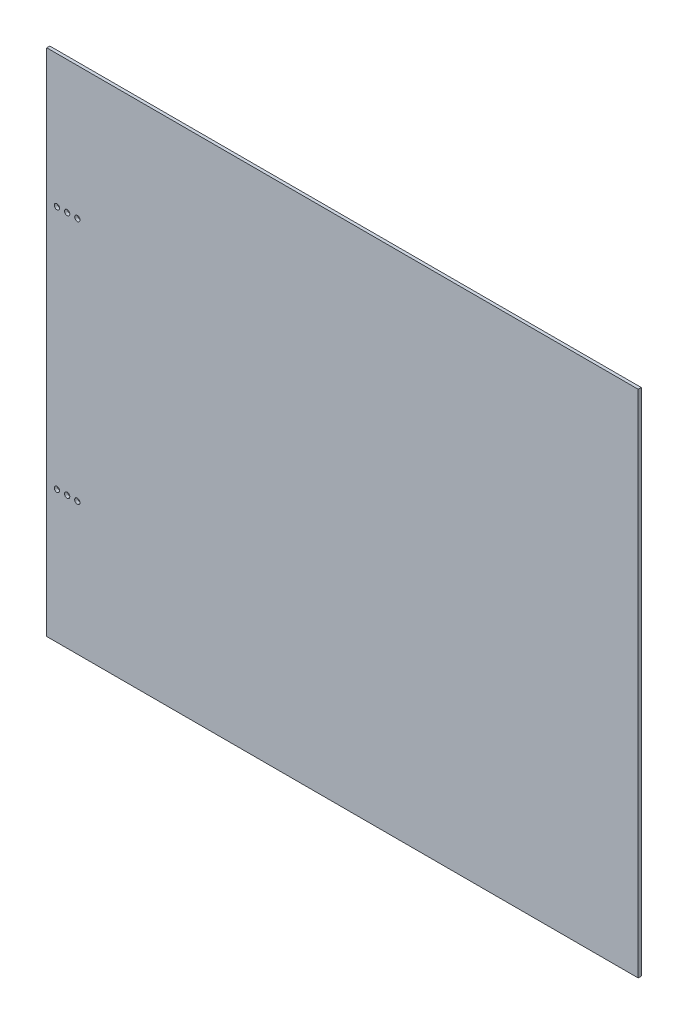
ISO-10303-21;
HEADER;
FILE_DESCRIPTION(('STEP AP214'),'2;1');
FILE_NAME('part.step','',(''),(''),'','','');
FILE_SCHEMA(('AUTOMOTIVE_DESIGN { 1 0 10303 214 1 1 1 1 }'));
ENDSEC;
DATA;
#1=APPLICATION_CONTEXT('core data for automotive mechanical design processes');
#2=APPLICATION_PROTOCOL_DEFINITION('international standard','automotive_design',2000,#1);
#3=PRODUCT_CONTEXT('',#1,'mechanical');
#4=PRODUCT('Part','Part','',(#3));
#5=PRODUCT_RELATED_PRODUCT_CATEGORY('part','',(#4));
#6=PRODUCT_DEFINITION_FORMATION('','',#4);
#7=PRODUCT_DEFINITION_CONTEXT('part definition',#1,'design');
#8=PRODUCT_DEFINITION('design','',#6,#7);
#9=PRODUCT_DEFINITION_SHAPE('','',#8);
#10=(LENGTH_UNIT() NAMED_UNIT(*) SI_UNIT(.MILLI.,.METRE.));
#11=(NAMED_UNIT(*) PLANE_ANGLE_UNIT() SI_UNIT($,.RADIAN.));
#12=(NAMED_UNIT(*) SI_UNIT($,.STERADIAN.) SOLID_ANGLE_UNIT());
#13=UNCERTAINTY_MEASURE_WITH_UNIT(LENGTH_MEASURE(1.E-05),#10,'distance_accuracy_value','');
#14=(GEOMETRIC_REPRESENTATION_CONTEXT(3) GLOBAL_UNCERTAINTY_ASSIGNED_CONTEXT((#13)) GLOBAL_UNIT_ASSIGNED_CONTEXT((#10,
#11,#12)) REPRESENTATION_CONTEXT('',''));
#15=CARTESIAN_POINT('',(0.,0.,0.));
#16=DIRECTION('',(0.,0.,1.));
#17=DIRECTION('',(1.,0.,0.));
#18=AXIS2_PLACEMENT_3D('',#15,#16,#17);
#19=CARTESIAN_POINT('',(0.,0.,3.));
#20=DIRECTION('',(0.,0.,-1.));
#21=DIRECTION('',(-1.,0.,0.));
#22=AXIS2_PLACEMENT_3D('',#19,#20,#21);
#23=PLANE('',#22);
#24=DIRECTION('',(0.,-1.,0.));
#25=VECTOR('',#24,1.);
#26=CARTESIAN_POINT('',(0.,0.,3.));
#27=LINE('',#26,#25);
#28=CARTESIAN_POINT('',(0.,500.,3.));
#29=VERTEX_POINT('',#28);
#30=CARTESIAN_POINT('',(0.,0.,3.));
#31=VERTEX_POINT('',#30);
#32=EDGE_CURVE('E86',#29,#31,#27,.T.);
#33=ORIENTED_EDGE('',*,*,#32,.T.);
#34=DIRECTION('',(1.,0.,0.));
#35=VECTOR('',#34,1.);
#36=CARTESIAN_POINT('',(0.,0.,3.));
#37=LINE('',#36,#35);
#38=CARTESIAN_POINT('',(580.,0.,3.));
#39=VERTEX_POINT('',#38);
#40=EDGE_CURVE('E81',#31,#39,#37,.T.);
#41=ORIENTED_EDGE('',*,*,#40,.T.);
#42=DIRECTION('',(0.,1.,0.));
#43=VECTOR('',#42,1.);
#44=CARTESIAN_POINT('',(580.,0.,3.));
#45=LINE('',#44,#43);
#46=CARTESIAN_POINT('',(580.,500.,3.));
#47=VERTEX_POINT('',#46);
#48=EDGE_CURVE('E84',#39,#47,#45,.T.);
#49=ORIENTED_EDGE('',*,*,#48,.T.);
#50=DIRECTION('',(-1.,0.,0.));
#51=VECTOR('',#50,1.);
#52=CARTESIAN_POINT('',(0.,500.,3.));
#53=LINE('',#52,#51);
#54=EDGE_CURVE('E51',#47,#29,#53,.T.);
#55=ORIENTED_EDGE('',*,*,#54,.T.);
#56=EDGE_LOOP('',(#33,#41,#49,#55));
#57=FACE_BOUND('',#56,.T.);
#58=CARTESIAN_POINT('',(10.,370.,3.));
#59=DIRECTION('',(0.,0.,1.));
#60=DIRECTION('',(1.,0.,0.));
#61=AXIS2_PLACEMENT_3D('',#58,#59,#60);
#62=CIRCLE('',#61,2.59999999999999);
#63=CARTESIAN_POINT('',(12.6,370.,3.));
#64=VERTEX_POINT('',#63);
#65=EDGE_CURVE('E101',#64,#64,#62,.T.);
#66=ORIENTED_EDGE('',*,*,#65,.F.);
#67=EDGE_LOOP('',(#66));
#68=FACE_BOUND('',#67,.T.);
#69=CARTESIAN_POINT('',(10.,130.,3.));
#70=DIRECTION('',(0.,0.,1.));
#71=DIRECTION('',(1.,0.,0.));
#72=AXIS2_PLACEMENT_3D('',#69,#70,#71);
#73=CIRCLE('',#72,2.59999999999999);
#74=CARTESIAN_POINT('',(12.6,130.,3.));
#75=VERTEX_POINT('',#74);
#76=EDGE_CURVE('E116',#75,#75,#73,.T.);
#77=ORIENTED_EDGE('',*,*,#76,.F.);
#78=EDGE_LOOP('',(#77));
#79=FACE_BOUND('',#78,.T.);
#80=CARTESIAN_POINT('',(20.,370.,3.));
#81=DIRECTION('',(0.,0.,1.));
#82=DIRECTION('',(1.,0.,0.));
#83=AXIS2_PLACEMENT_3D('',#80,#81,#82);
#84=CIRCLE('',#83,2.59999999999998);
#85=CARTESIAN_POINT('',(22.6,370.,3.));
#86=VERTEX_POINT('',#85);
#87=EDGE_CURVE('E122',#86,#86,#84,.T.);
#88=ORIENTED_EDGE('',*,*,#87,.F.);
#89=EDGE_LOOP('',(#88));
#90=FACE_BOUND('',#89,.T.);
#91=CARTESIAN_POINT('',(20.,130.,3.));
#92=DIRECTION('',(0.,0.,1.));
#93=DIRECTION('',(1.,0.,0.));
#94=AXIS2_PLACEMENT_3D('',#91,#92,#93);
#95=CIRCLE('',#94,2.59999999999999);
#96=CARTESIAN_POINT('',(22.6,130.,3.));
#97=VERTEX_POINT('',#96);
#98=EDGE_CURVE('E128',#97,#97,#95,.T.);
#99=ORIENTED_EDGE('',*,*,#98,.F.);
#100=EDGE_LOOP('',(#99));
#101=FACE_BOUND('',#100,.T.);
#102=CARTESIAN_POINT('',(30.,370.,3.));
#103=DIRECTION('',(0.,0.,1.));
#104=DIRECTION('',(1.,0.,0.));
#105=AXIS2_PLACEMENT_3D('',#102,#103,#104);
#106=CIRCLE('',#105,2.59999999999999);
#107=CARTESIAN_POINT('',(32.6,370.,3.));
#108=VERTEX_POINT('',#107);
#109=EDGE_CURVE('E134',#108,#108,#106,.T.);
#110=ORIENTED_EDGE('',*,*,#109,.F.);
#111=EDGE_LOOP('',(#110));
#112=FACE_BOUND('',#111,.T.);
#113=CARTESIAN_POINT('',(30.,130.,3.));
#114=DIRECTION('',(0.,0.,1.));
#115=DIRECTION('',(1.,0.,0.));
#116=AXIS2_PLACEMENT_3D('',#113,#114,#115);
#117=CIRCLE('',#116,2.59999999999999);
#118=CARTESIAN_POINT('',(32.6,130.,3.));
#119=VERTEX_POINT('',#118);
#120=EDGE_CURVE('E140',#119,#119,#117,.T.);
#121=ORIENTED_EDGE('',*,*,#120,.F.);
#122=EDGE_LOOP('',(#121));
#123=FACE_BOUND('',#122,.T.);
#124=ADVANCED_FACE('F34',(#57,#68,#79,#90,#101,#112,#123),#23,.F.);
#125=CARTESIAN_POINT('',(0.,0.,0.));
#126=DIRECTION('',(0.,0.,-1.));
#127=DIRECTION('',(-1.,0.,0.));
#128=AXIS2_PLACEMENT_3D('',#125,#126,#127);
#129=PLANE('',#128);
#130=CARTESIAN_POINT('',(30.,370.,0.));
#131=DIRECTION('',(0.,0.,1.));
#132=DIRECTION('',(1.,0.,0.));
#133=AXIS2_PLACEMENT_3D('',#130,#131,#132);
#134=CIRCLE('',#133,2.59999999999999);
#135=CARTESIAN_POINT('',(32.6,370.,0.));
#136=VERTEX_POINT('',#135);
#137=EDGE_CURVE('E137',#136,#136,#134,.T.);
#138=ORIENTED_EDGE('',*,*,#137,.T.);
#139=EDGE_LOOP('',(#138));
#140=FACE_BOUND('',#139,.T.);
#141=CARTESIAN_POINT('',(20.,370.,0.));
#142=DIRECTION('',(0.,0.,1.));
#143=DIRECTION('',(1.,0.,0.));
#144=AXIS2_PLACEMENT_3D('',#141,#142,#143);
#145=CIRCLE('',#144,2.59999999999998);
#146=CARTESIAN_POINT('',(22.6,370.,0.));
#147=VERTEX_POINT('',#146);
#148=EDGE_CURVE('E125',#147,#147,#145,.T.);
#149=ORIENTED_EDGE('',*,*,#148,.T.);
#150=EDGE_LOOP('',(#149));
#151=FACE_BOUND('',#150,.T.);
#152=CARTESIAN_POINT('',(10.,370.,0.));
#153=DIRECTION('',(0.,0.,1.));
#154=DIRECTION('',(1.,0.,0.));
#155=AXIS2_PLACEMENT_3D('',#152,#153,#154);
#156=CIRCLE('',#155,2.59999999999999);
#157=CARTESIAN_POINT('',(12.6,370.,0.));
#158=VERTEX_POINT('',#157);
#159=EDGE_CURVE('E113',#158,#158,#156,.T.);
#160=ORIENTED_EDGE('',*,*,#159,.T.);
#161=EDGE_LOOP('',(#160));
#162=FACE_BOUND('',#161,.T.);
#163=DIRECTION('',(0.,-1.,0.));
#164=VECTOR('',#163,1.);
#165=CARTESIAN_POINT('',(0.,0.,0.));
#166=LINE('',#165,#164);
#167=CARTESIAN_POINT('',(0.,500.,0.));
#168=VERTEX_POINT('',#167);
#169=CARTESIAN_POINT('',(0.,0.,0.));
#170=VERTEX_POINT('',#169);
#171=EDGE_CURVE('E98',#168,#170,#166,.T.);
#172=ORIENTED_EDGE('',*,*,#171,.F.);
#173=DIRECTION('',(-1.,0.,0.));
#174=VECTOR('',#173,1.);
#175=CARTESIAN_POINT('',(0.,500.,0.));
#176=LINE('',#175,#174);
#177=CARTESIAN_POINT('',(580.,500.,0.));
#178=VERTEX_POINT('',#177);
#179=EDGE_CURVE('E74',#178,#168,#176,.T.);
#180=ORIENTED_EDGE('',*,*,#179,.F.);
#181=DIRECTION('',(0.,1.,0.));
#182=VECTOR('',#181,1.);
#183=CARTESIAN_POINT('',(580.,0.,0.));
#184=LINE('',#183,#182);
#185=CARTESIAN_POINT('',(580.,0.,0.));
#186=VERTEX_POINT('',#185);
#187=EDGE_CURVE('E68',#186,#178,#184,.T.);
#188=ORIENTED_EDGE('',*,*,#187,.F.);
#189=DIRECTION('',(1.,0.,0.));
#190=VECTOR('',#189,1.);
#191=CARTESIAN_POINT('',(0.,0.,0.));
#192=LINE('',#191,#190);
#193=EDGE_CURVE('E90',#170,#186,#192,.T.);
#194=ORIENTED_EDGE('',*,*,#193,.F.);
#195=EDGE_LOOP('',(#172,#180,#188,#194));
#196=FACE_BOUND('',#195,.T.);
#197=CARTESIAN_POINT('',(10.,130.,0.));
#198=DIRECTION('',(0.,0.,1.));
#199=DIRECTION('',(1.,0.,0.));
#200=AXIS2_PLACEMENT_3D('',#197,#198,#199);
#201=CIRCLE('',#200,2.59999999999999);
#202=CARTESIAN_POINT('',(12.6,130.,0.));
#203=VERTEX_POINT('',#202);
#204=EDGE_CURVE('E119',#203,#203,#201,.T.);
#205=ORIENTED_EDGE('',*,*,#204,.T.);
#206=EDGE_LOOP('',(#205));
#207=FACE_BOUND('',#206,.T.);
#208=CARTESIAN_POINT('',(20.,130.,0.));
#209=DIRECTION('',(0.,0.,1.));
#210=DIRECTION('',(1.,0.,0.));
#211=AXIS2_PLACEMENT_3D('',#208,#209,#210);
#212=CIRCLE('',#211,2.59999999999999);
#213=CARTESIAN_POINT('',(22.6,130.,0.));
#214=VERTEX_POINT('',#213);
#215=EDGE_CURVE('E131',#214,#214,#212,.T.);
#216=ORIENTED_EDGE('',*,*,#215,.T.);
#217=EDGE_LOOP('',(#216));
#218=FACE_BOUND('',#217,.T.);
#219=CARTESIAN_POINT('',(30.,130.,0.));
#220=DIRECTION('',(0.,0.,1.));
#221=DIRECTION('',(1.,0.,0.));
#222=AXIS2_PLACEMENT_3D('',#219,#220,#221);
#223=CIRCLE('',#222,2.59999999999999);
#224=CARTESIAN_POINT('',(32.6,130.,0.));
#225=VERTEX_POINT('',#224);
#226=EDGE_CURVE('E143',#225,#225,#223,.T.);
#227=ORIENTED_EDGE('',*,*,#226,.T.);
#228=EDGE_LOOP('',(#227));
#229=FACE_BOUND('',#228,.T.);
#230=ADVANCED_FACE('F109',(#140,#151,#162,#196,#207,#218,#229),#129,.T.);
#231=CARTESIAN_POINT('',(0.,0.,3.));
#232=DIRECTION('',(1.,0.,0.));
#233=DIRECTION('',(0.,0.,-1.));
#234=AXIS2_PLACEMENT_3D('',#231,#232,#233);
#235=PLANE('',#234);
#236=ORIENTED_EDGE('',*,*,#171,.T.);
#237=DIRECTION('',(0.,0.,-1.));
#238=VECTOR('',#237,1.);
#239=CARTESIAN_POINT('',(0.,0.,3.));
#240=LINE('',#239,#238);
#241=EDGE_CURVE('E11',#31,#170,#240,.T.);
#242=ORIENTED_EDGE('',*,*,#241,.F.);
#243=ORIENTED_EDGE('',*,*,#32,.F.);
#244=DIRECTION('',(0.,0.,-1.));
#245=VECTOR('',#244,1.);
#246=CARTESIAN_POINT('',(0.,500.,3.));
#247=LINE('',#246,#245);
#248=EDGE_CURVE('E94',#29,#168,#247,.T.);
#249=ORIENTED_EDGE('',*,*,#248,.T.);
#250=EDGE_LOOP('',(#236,#242,#243,#249));
#251=FACE_BOUND('',#250,.T.);
#252=ADVANCED_FACE('F36',(#251),#235,.F.);
#253=CARTESIAN_POINT('',(0.,0.,3.));
#254=DIRECTION('',(0.,1.,0.));
#255=DIRECTION('',(0.,0.,1.));
#256=AXIS2_PLACEMENT_3D('',#253,#254,#255);
#257=PLANE('',#256);
#258=ORIENTED_EDGE('',*,*,#193,.T.);
#259=DIRECTION('',(0.,0.,-1.));
#260=VECTOR('',#259,1.);
#261=CARTESIAN_POINT('',(580.,0.,3.));
#262=LINE('',#261,#260);
#263=EDGE_CURVE('E43',#39,#186,#262,.T.);
#264=ORIENTED_EDGE('',*,*,#263,.F.);
#265=ORIENTED_EDGE('',*,*,#40,.F.);
#266=ORIENTED_EDGE('',*,*,#241,.T.);
#267=EDGE_LOOP('',(#258,#264,#265,#266));
#268=FACE_BOUND('',#267,.T.);
#269=ADVANCED_FACE('F89',(#268),#257,.F.);
#270=CARTESIAN_POINT('',(580.,0.,3.));
#271=DIRECTION('',(-1.,0.,0.));
#272=DIRECTION('',(0.,0.,1.));
#273=AXIS2_PLACEMENT_3D('',#270,#271,#272);
#274=PLANE('',#273);
#275=ORIENTED_EDGE('',*,*,#187,.T.);
#276=DIRECTION('',(0.,0.,-1.));
#277=VECTOR('',#276,1.);
#278=CARTESIAN_POINT('',(580.,500.,3.));
#279=LINE('',#278,#277);
#280=EDGE_CURVE('E91',#47,#178,#279,.T.);
#281=ORIENTED_EDGE('',*,*,#280,.F.);
#282=ORIENTED_EDGE('',*,*,#48,.F.);
#283=ORIENTED_EDGE('',*,*,#263,.T.);
#284=EDGE_LOOP('',(#275,#281,#282,#283));
#285=FACE_BOUND('',#284,.T.);
#286=ADVANCED_FACE('F92',(#285),#274,.F.);
#287=CARTESIAN_POINT('',(0.,500.,3.));
#288=DIRECTION('',(0.,-1.,0.));
#289=DIRECTION('',(0.,0.,-1.));
#290=AXIS2_PLACEMENT_3D('',#287,#288,#289);
#291=PLANE('',#290);
#292=ORIENTED_EDGE('',*,*,#179,.T.);
#293=ORIENTED_EDGE('',*,*,#248,.F.);
#294=ORIENTED_EDGE('',*,*,#54,.F.);
#295=ORIENTED_EDGE('',*,*,#280,.T.);
#296=EDGE_LOOP('',(#292,#293,#294,#295));
#297=FACE_BOUND('',#296,.T.);
#298=ADVANCED_FACE('F106',(#297),#291,.F.);
#299=CARTESIAN_POINT('',(10.,370.,3.));
#300=DIRECTION('',(0.,0.,-1.));
#301=DIRECTION('',(-1.,0.,0.));
#302=AXIS2_PLACEMENT_3D('',#299,#300,#301);
#303=CYLINDRICAL_SURFACE('',#302,2.59999999999999);
#304=ORIENTED_EDGE('',*,*,#65,.T.);
#305=EDGE_LOOP('',(#304));
#306=FACE_BOUND('',#305,.T.);
#307=ORIENTED_EDGE('',*,*,#159,.F.);
#308=EDGE_LOOP('',(#307));
#309=FACE_BOUND('',#308,.T.);
#310=ADVANCED_FACE('F160',(#306,#309),#303,.F.);
#311=CARTESIAN_POINT('',(10.,130.,3.));
#312=DIRECTION('',(0.,0.,-1.));
#313=DIRECTION('',(-1.,0.,0.));
#314=AXIS2_PLACEMENT_3D('',#311,#312,#313);
#315=CYLINDRICAL_SURFACE('',#314,2.59999999999999);
#316=ORIENTED_EDGE('',*,*,#76,.T.);
#317=EDGE_LOOP('',(#316));
#318=FACE_BOUND('',#317,.T.);
#319=ORIENTED_EDGE('',*,*,#204,.F.);
#320=EDGE_LOOP('',(#319));
#321=FACE_BOUND('',#320,.T.);
#322=ADVANCED_FACE('F206',(#318,#321),#315,.F.);
#323=CARTESIAN_POINT('',(20.,370.,3.));
#324=DIRECTION('',(0.,0.,-1.));
#325=DIRECTION('',(-1.,0.,0.));
#326=AXIS2_PLACEMENT_3D('',#323,#324,#325);
#327=CYLINDRICAL_SURFACE('',#326,2.59999999999998);
#328=ORIENTED_EDGE('',*,*,#87,.T.);
#329=EDGE_LOOP('',(#328));
#330=FACE_BOUND('',#329,.T.);
#331=ORIENTED_EDGE('',*,*,#148,.F.);
#332=EDGE_LOOP('',(#331));
#333=FACE_BOUND('',#332,.T.);
#334=ADVANCED_FACE('F214',(#330,#333),#327,.F.);
#335=CARTESIAN_POINT('',(20.,130.,3.));
#336=DIRECTION('',(0.,0.,-1.));
#337=DIRECTION('',(-1.,0.,0.));
#338=AXIS2_PLACEMENT_3D('',#335,#336,#337);
#339=CYLINDRICAL_SURFACE('',#338,2.59999999999999);
#340=ORIENTED_EDGE('',*,*,#98,.T.);
#341=EDGE_LOOP('',(#340));
#342=FACE_BOUND('',#341,.T.);
#343=ORIENTED_EDGE('',*,*,#215,.F.);
#344=EDGE_LOOP('',(#343));
#345=FACE_BOUND('',#344,.T.);
#346=ADVANCED_FACE('F222',(#342,#345),#339,.F.);
#347=CARTESIAN_POINT('',(30.,370.,3.));
#348=DIRECTION('',(0.,0.,-1.));
#349=DIRECTION('',(-1.,0.,0.));
#350=AXIS2_PLACEMENT_3D('',#347,#348,#349);
#351=CYLINDRICAL_SURFACE('',#350,2.59999999999999);
#352=ORIENTED_EDGE('',*,*,#109,.T.);
#353=EDGE_LOOP('',(#352));
#354=FACE_BOUND('',#353,.T.);
#355=ORIENTED_EDGE('',*,*,#137,.F.);
#356=EDGE_LOOP('',(#355));
#357=FACE_BOUND('',#356,.T.);
#358=ADVANCED_FACE('F231',(#354,#357),#351,.F.);
#359=CARTESIAN_POINT('',(30.,130.,3.));
#360=DIRECTION('',(0.,0.,-1.));
#361=DIRECTION('',(-1.,0.,0.));
#362=AXIS2_PLACEMENT_3D('',#359,#360,#361);
#363=CYLINDRICAL_SURFACE('',#362,2.59999999999999);
#364=ORIENTED_EDGE('',*,*,#120,.T.);
#365=EDGE_LOOP('',(#364));
#366=FACE_BOUND('',#365,.T.);
#367=ORIENTED_EDGE('',*,*,#226,.F.);
#368=EDGE_LOOP('',(#367));
#369=FACE_BOUND('',#368,.T.);
#370=ADVANCED_FACE('F149',(#366,#369),#363,.F.);
#371=CLOSED_SHELL('',(#124,#230,#252,#269,#286,#298,#310,#322,#334,#346,#358,#370));
#372=MANIFOLD_SOLID_BREP('B2',#371);
#373=ADVANCED_BREP_SHAPE_REPRESENTATION('',(#18,#372),#14);
#374=SHAPE_DEFINITION_REPRESENTATION(#9,#373);
ENDSEC;
END-ISO-10303-21;
